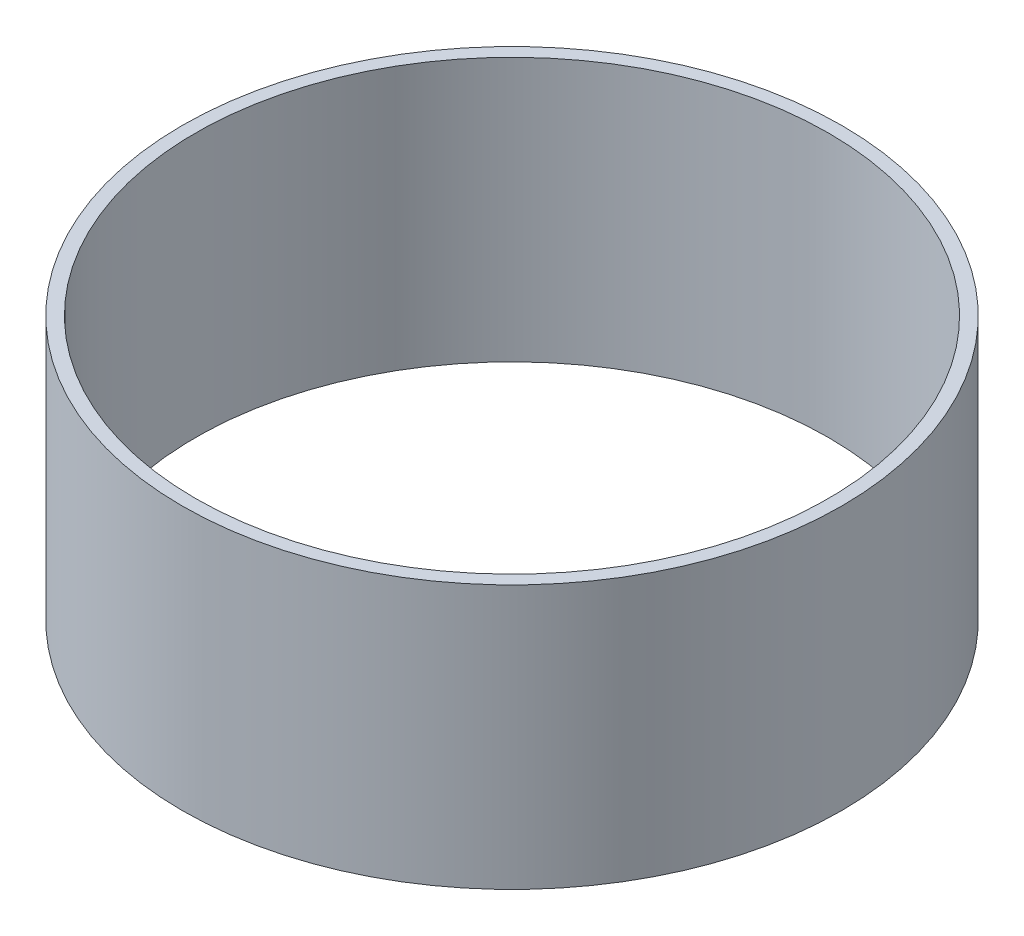
ISO-10303-21;
HEADER;
FILE_DESCRIPTION(('STEP AP214'),'2;1');
FILE_NAME('part.step','',(''),(''),'','','');
FILE_SCHEMA(('AUTOMOTIVE_DESIGN { 1 0 10303 214 1 1 1 1 }'));
ENDSEC;
DATA;
#1=APPLICATION_CONTEXT('core data for automotive mechanical design processes');
#2=APPLICATION_PROTOCOL_DEFINITION('international standard','automotive_design',2000,#1);
#3=PRODUCT_CONTEXT('',#1,'mechanical');
#4=PRODUCT('Part','Part','',(#3));
#5=PRODUCT_RELATED_PRODUCT_CATEGORY('part','',(#4));
#6=PRODUCT_DEFINITION_FORMATION('','',#4);
#7=PRODUCT_DEFINITION_CONTEXT('part definition',#1,'design');
#8=PRODUCT_DEFINITION('design','',#6,#7);
#9=PRODUCT_DEFINITION_SHAPE('','',#8);
#10=(LENGTH_UNIT() NAMED_UNIT(*) SI_UNIT(.MILLI.,.METRE.));
#11=(NAMED_UNIT(*) PLANE_ANGLE_UNIT() SI_UNIT($,.RADIAN.));
#12=(NAMED_UNIT(*) SI_UNIT($,.STERADIAN.) SOLID_ANGLE_UNIT());
#13=UNCERTAINTY_MEASURE_WITH_UNIT(LENGTH_MEASURE(1.E-05),#10,'distance_accuracy_value','');
#14=(GEOMETRIC_REPRESENTATION_CONTEXT(3) GLOBAL_UNCERTAINTY_ASSIGNED_CONTEXT((#13)) GLOBAL_UNIT_ASSIGNED_CONTEXT((#10,
#11,#12)) REPRESENTATION_CONTEXT('',''));
#15=CARTESIAN_POINT('',(0.,0.,0.));
#16=DIRECTION('',(0.,0.,1.));
#17=DIRECTION('',(1.,0.,0.));
#18=AXIS2_PLACEMENT_3D('',#15,#16,#17);
#19=CARTESIAN_POINT('',(0.,10.,0.));
#20=DIRECTION('',(0.,1.,0.));
#21=DIRECTION('',(0.,0.,1.));
#22=AXIS2_PLACEMENT_3D('',#19,#20,#21);
#23=PLANE('',#22);
#24=CARTESIAN_POINT('',(0.,10.,0.));
#25=DIRECTION('',(0.,1.,0.));
#26=DIRECTION('',(0.,0.,1.));
#27=AXIS2_PLACEMENT_3D('',#24,#25,#26);
#28=CIRCLE('',#27,12.5);
#29=CARTESIAN_POINT('',(0.,10.,12.5));
#30=VERTEX_POINT('',#29);
#31=EDGE_CURVE('E10',#30,#30,#28,.T.);
#32=ORIENTED_EDGE('',*,*,#31,.T.);
#33=EDGE_LOOP('',(#32));
#34=FACE_BOUND('',#33,.T.);
#35=CARTESIAN_POINT('',(0.,10.,0.));
#36=DIRECTION('',(0.,1.,0.));
#37=DIRECTION('',(0.,0.,1.));
#38=AXIS2_PLACEMENT_3D('',#35,#36,#37);
#39=CIRCLE('',#38,12.);
#40=CARTESIAN_POINT('',(0.,10.,12.));
#41=VERTEX_POINT('',#40);
#42=EDGE_CURVE('E58',#41,#41,#39,.T.);
#43=ORIENTED_EDGE('',*,*,#42,.F.);
#44=EDGE_LOOP('',(#43));
#45=FACE_BOUND('',#44,.T.);
#46=ADVANCED_FACE('F47',(#34,#45),#23,.T.);
#47=CARTESIAN_POINT('',(0.,0.,0.));
#48=DIRECTION('',(0.,1.,0.));
#49=DIRECTION('',(0.,0.,1.));
#50=AXIS2_PLACEMENT_3D('',#47,#48,#49);
#51=PLANE('',#50);
#52=CARTESIAN_POINT('',(0.,0.,0.));
#53=DIRECTION('',(0.,1.,0.));
#54=DIRECTION('',(0.,0.,1.));
#55=AXIS2_PLACEMENT_3D('',#52,#53,#54);
#56=CIRCLE('',#55,12.5);
#57=CARTESIAN_POINT('',(0.,0.,12.5));
#58=VERTEX_POINT('',#57);
#59=EDGE_CURVE('E51',#58,#58,#56,.T.);
#60=ORIENTED_EDGE('',*,*,#59,.F.);
#61=EDGE_LOOP('',(#60));
#62=FACE_BOUND('',#61,.T.);
#63=CARTESIAN_POINT('',(0.,0.,0.));
#64=DIRECTION('',(0.,1.,0.));
#65=DIRECTION('',(0.,0.,1.));
#66=AXIS2_PLACEMENT_3D('',#63,#64,#65);
#67=CIRCLE('',#66,12.);
#68=CARTESIAN_POINT('',(0.,0.,12.));
#69=VERTEX_POINT('',#68);
#70=EDGE_CURVE('E60',#69,#69,#67,.T.);
#71=ORIENTED_EDGE('',*,*,#70,.T.);
#72=EDGE_LOOP('',(#71));
#73=FACE_BOUND('',#72,.T.);
#74=ADVANCED_FACE('F70',(#62,#73),#51,.F.);
#75=CARTESIAN_POINT('',(0.,10.,0.));
#76=DIRECTION('',(0.,-1.,0.));
#77=DIRECTION('',(0.,0.,-1.));
#78=AXIS2_PLACEMENT_3D('',#75,#76,#77);
#79=CYLINDRICAL_SURFACE('',#78,12.5);
#80=ORIENTED_EDGE('',*,*,#31,.F.);
#81=EDGE_LOOP('',(#80));
#82=FACE_BOUND('',#81,.T.);
#83=ORIENTED_EDGE('',*,*,#59,.T.);
#84=EDGE_LOOP('',(#83));
#85=FACE_BOUND('',#84,.T.);
#86=ADVANCED_FACE('F49',(#82,#85),#79,.T.);
#87=CARTESIAN_POINT('',(0.,10.,0.));
#88=DIRECTION('',(0.,-1.,0.));
#89=DIRECTION('',(0.,0.,-1.));
#90=AXIS2_PLACEMENT_3D('',#87,#88,#89);
#91=CYLINDRICAL_SURFACE('',#90,12.);
#92=ORIENTED_EDGE('',*,*,#42,.T.);
#93=EDGE_LOOP('',(#92));
#94=FACE_BOUND('',#93,.T.);
#95=ORIENTED_EDGE('',*,*,#70,.F.);
#96=EDGE_LOOP('',(#95));
#97=FACE_BOUND('',#96,.T.);
#98=ADVANCED_FACE('F66',(#94,#97),#91,.F.);
#99=CLOSED_SHELL('',(#46,#74,#86,#98));
#100=MANIFOLD_SOLID_BREP('B2',#99);
#101=ADVANCED_BREP_SHAPE_REPRESENTATION('',(#18,#100),#14);
#102=SHAPE_DEFINITION_REPRESENTATION(#9,#101);
ENDSEC;
END-ISO-10303-21;
